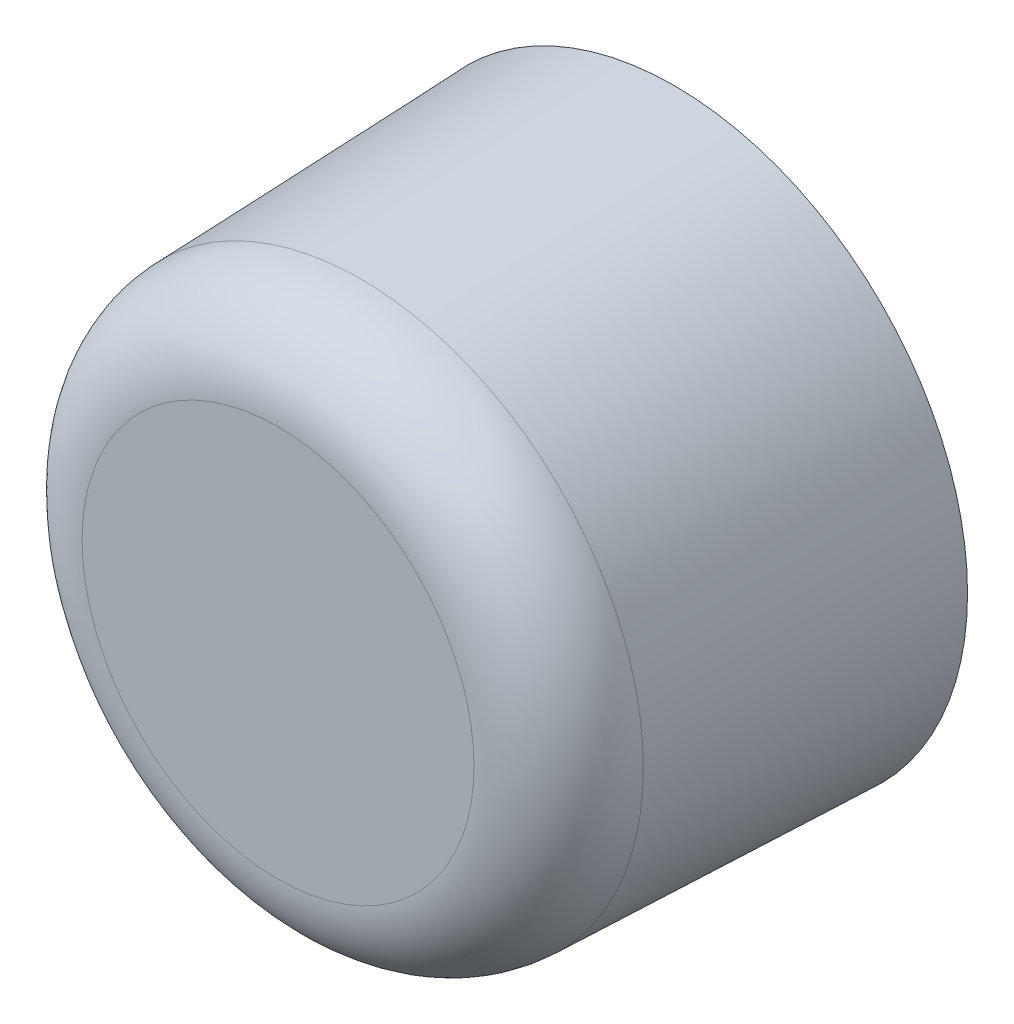
ISO-10303-21;
HEADER;
FILE_DESCRIPTION(('STEP AP214'),'2;1');
FILE_NAME('part.step','',(''),(''),'','','');
FILE_SCHEMA(('AUTOMOTIVE_DESIGN { 1 0 10303 214 1 1 1 1 }'));
ENDSEC;
DATA;
#1=APPLICATION_CONTEXT('core data for automotive mechanical design processes');
#2=APPLICATION_PROTOCOL_DEFINITION('international standard','automotive_design',2000,#1);
#3=PRODUCT_CONTEXT('',#1,'mechanical');
#4=PRODUCT('Part','Part','',(#3));
#5=PRODUCT_RELATED_PRODUCT_CATEGORY('part','',(#4));
#6=PRODUCT_DEFINITION_FORMATION('','',#4);
#7=PRODUCT_DEFINITION_CONTEXT('part definition',#1,'design');
#8=PRODUCT_DEFINITION('design','',#6,#7);
#9=PRODUCT_DEFINITION_SHAPE('','',#8);
#10=(LENGTH_UNIT() NAMED_UNIT(*) SI_UNIT(.MILLI.,.METRE.));
#11=(NAMED_UNIT(*) PLANE_ANGLE_UNIT() SI_UNIT($,.RADIAN.));
#12=(NAMED_UNIT(*) SI_UNIT($,.STERADIAN.) SOLID_ANGLE_UNIT());
#13=UNCERTAINTY_MEASURE_WITH_UNIT(LENGTH_MEASURE(1.E-05),#10,'distance_accuracy_value','');
#14=(GEOMETRIC_REPRESENTATION_CONTEXT(3) GLOBAL_UNCERTAINTY_ASSIGNED_CONTEXT((#13)) GLOBAL_UNIT_ASSIGNED_CONTEXT((#10,
#11,#12)) REPRESENTATION_CONTEXT('',''));
#15=CARTESIAN_POINT('',(0.,0.,0.));
#16=DIRECTION('',(0.,0.,1.));
#17=DIRECTION('',(1.,0.,0.));
#18=AXIS2_PLACEMENT_3D('',#15,#16,#17);
#19=CARTESIAN_POINT('',(0.,0.,0.));
#20=DIRECTION('',(0.,0.,-1.));
#21=DIRECTION('',(1.,0.,0.));
#22=AXIS2_PLACEMENT_3D('',#19,#20,#21);
#23=CONICAL_SURFACE('',#22,3.4,0.0349065850398867);
#24=CARTESIAN_POINT('',(0.,0.,3.6348994967025));
#25=DIRECTION('',(0.,0.,-1.));
#26=DIRECTION('',(-1.,0.,0.));
#27=AXIS2_PLACEMENT_3D('',#24,#25,#26);
#28=CIRCLE('',#27,3.27306651254998);
#29=CARTESIAN_POINT('',(-3.27306651254998,0.,3.6348994967025));
#30=VERTEX_POINT('',#29);
#31=EDGE_CURVE('E10',#30,#30,#28,.T.);
#32=ORIENTED_EDGE('',*,*,#31,.T.);
#33=EDGE_LOOP('',(#32));
#34=FACE_BOUND('',#33,.T.);
#35=CARTESIAN_POINT('',(0.,0.,0.));
#36=DIRECTION('',(0.,0.,1.));
#37=DIRECTION('',(1.,0.,0.));
#38=AXIS2_PLACEMENT_3D('',#35,#36,#37);
#39=CIRCLE('',#38,3.4);
#40=CARTESIAN_POINT('',(3.4,0.,0.));
#41=VERTEX_POINT('',#40);
#42=EDGE_CURVE('E48',#41,#41,#39,.T.);
#43=ORIENTED_EDGE('',*,*,#42,.T.);
#44=EDGE_LOOP('',(#43));
#45=FACE_BOUND('',#44,.T.);
#46=ADVANCED_FACE('F40',(#34,#45),#23,.T.);
#47=CARTESIAN_POINT('',(0.,0.,4.6));
#48=DIRECTION('',(0.,0.,1.));
#49=DIRECTION('',(1.,0.,0.));
#50=AXIS2_PLACEMENT_3D('',#47,#48,#49);
#51=PLANE('',#50);
#52=CARTESIAN_POINT('',(0.,0.,4.6));
#53=DIRECTION('',(0.,0.,1.));
#54=DIRECTION('',(1.,0.,0.));
#55=AXIS2_PLACEMENT_3D('',#52,#53,#54);
#56=CIRCLE('',#55,2.27367568553089);
#57=CARTESIAN_POINT('',(2.27367568553089,0.,4.6));
#58=VERTEX_POINT('',#57);
#59=EDGE_CURVE('E42',#58,#58,#56,.T.);
#60=ORIENTED_EDGE('',*,*,#59,.T.);
#61=EDGE_LOOP('',(#60));
#62=FACE_BOUND('',#61,.T.);
#63=ADVANCED_FACE('F59',(#62),#51,.T.);
#64=CARTESIAN_POINT('',(0.,0.,0.));
#65=DIRECTION('',(0.,0.,1.));
#66=DIRECTION('',(1.,0.,0.));
#67=AXIS2_PLACEMENT_3D('',#64,#65,#66);
#68=PLANE('',#67);
#69=ORIENTED_EDGE('',*,*,#42,.F.);
#70=EDGE_LOOP('',(#69));
#71=FACE_BOUND('',#70,.T.);
#72=ADVANCED_FACE('F57',(#71),#68,.F.);
#73=CARTESIAN_POINT('',(0.,0.,3.6));
#74=DIRECTION('',(0.,0.,1.));
#75=DIRECTION('',(1.,0.,0.));
#76=AXIS2_PLACEMENT_3D('',#73,#74,#75);
#77=TOROIDAL_SURFACE('',#76,2.27367568553089,1.);
#78=ORIENTED_EDGE('',*,*,#31,.F.);
#79=EDGE_LOOP('',(#78));
#80=FACE_BOUND('',#79,.T.);
#81=ORIENTED_EDGE('',*,*,#59,.F.);
#82=EDGE_LOOP('',(#81));
#83=FACE_BOUND('',#82,.T.);
#84=ADVANCED_FACE('F39',(#80,#83),#77,.T.);
#85=CLOSED_SHELL('',(#46,#63,#72,#84));
#86=MANIFOLD_SOLID_BREP('B2',#85);
#87=ADVANCED_BREP_SHAPE_REPRESENTATION('',(#18,#86),#14);
#88=SHAPE_DEFINITION_REPRESENTATION(#9,#87);
ENDSEC;
END-ISO-10303-21;
